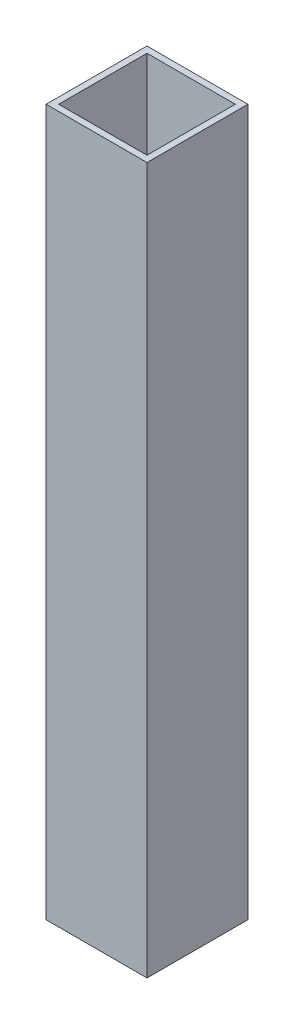
ISO-10303-21;
HEADER;
FILE_DESCRIPTION(('STEP AP214'),'2;1');
FILE_NAME('part.step','',(''),(''),'','','');
FILE_SCHEMA(('AUTOMOTIVE_DESIGN { 1 0 10303 214 1 1 1 1 }'));
ENDSEC;
DATA;
#1=APPLICATION_CONTEXT('core data for automotive mechanical design processes');
#2=APPLICATION_PROTOCOL_DEFINITION('international standard','automotive_design',2000,#1);
#3=PRODUCT_CONTEXT('',#1,'mechanical');
#4=PRODUCT('Part','Part','',(#3));
#5=PRODUCT_RELATED_PRODUCT_CATEGORY('part','',(#4));
#6=PRODUCT_DEFINITION_FORMATION('','',#4);
#7=PRODUCT_DEFINITION_CONTEXT('part definition',#1,'design');
#8=PRODUCT_DEFINITION('design','',#6,#7);
#9=PRODUCT_DEFINITION_SHAPE('','',#8);
#10=(LENGTH_UNIT() NAMED_UNIT(*) SI_UNIT(.MILLI.,.METRE.));
#11=(NAMED_UNIT(*) PLANE_ANGLE_UNIT() SI_UNIT($,.RADIAN.));
#12=(NAMED_UNIT(*) SI_UNIT($,.STERADIAN.) SOLID_ANGLE_UNIT());
#13=UNCERTAINTY_MEASURE_WITH_UNIT(LENGTH_MEASURE(1.E-05),#10,'distance_accuracy_value','');
#14=(GEOMETRIC_REPRESENTATION_CONTEXT(3) GLOBAL_UNCERTAINTY_ASSIGNED_CONTEXT((#13)) GLOBAL_UNIT_ASSIGNED_CONTEXT((#10,
#11,#12)) REPRESENTATION_CONTEXT('',''));
#15=CARTESIAN_POINT('',(0.,0.,0.));
#16=DIRECTION('',(0.,0.,1.));
#17=DIRECTION('',(1.,0.,0.));
#18=AXIS2_PLACEMENT_3D('',#15,#16,#17);
#19=CARTESIAN_POINT('',(0.,177.8,0.));
#20=DIRECTION('',(0.,1.,0.));
#21=DIRECTION('',(0.,0.,1.));
#22=AXIS2_PLACEMENT_3D('',#19,#20,#21);
#23=PLANE('',#22);
#24=DIRECTION('',(0.,0.,1.));
#25=VECTOR('',#24,1.);
#26=CARTESIAN_POINT('',(-12.7,177.8,12.7));
#27=LINE('',#26,#25);
#28=CARTESIAN_POINT('',(-12.7,177.8,-12.7));
#29=VERTEX_POINT('',#28);
#30=CARTESIAN_POINT('',(-12.7,177.8,12.7));
#31=VERTEX_POINT('',#30);
#32=EDGE_CURVE('E136',#29,#31,#27,.T.);
#33=ORIENTED_EDGE('',*,*,#32,.T.);
#34=DIRECTION('',(1.,0.,0.));
#35=VECTOR('',#34,1.);
#36=CARTESIAN_POINT('',(12.7,177.8,12.7));
#37=LINE('',#36,#35);
#38=CARTESIAN_POINT('',(12.7,177.8,12.7));
#39=VERTEX_POINT('',#38);
#40=EDGE_CURVE('E139',#31,#39,#37,.T.);
#41=ORIENTED_EDGE('',*,*,#40,.T.);
#42=DIRECTION('',(0.,0.,-1.));
#43=VECTOR('',#42,1.);
#44=CARTESIAN_POINT('',(12.7,177.8,12.7));
#45=LINE('',#44,#43);
#46=CARTESIAN_POINT('',(12.7,177.8,-12.7));
#47=VERTEX_POINT('',#46);
#48=EDGE_CURVE('E142',#39,#47,#45,.T.);
#49=ORIENTED_EDGE('',*,*,#48,.T.);
#50=DIRECTION('',(-1.,0.,0.));
#51=VECTOR('',#50,1.);
#52=CARTESIAN_POINT('',(12.7,177.8,-12.7));
#53=LINE('',#52,#51);
#54=EDGE_CURVE('E144',#47,#29,#53,.T.);
#55=ORIENTED_EDGE('',*,*,#54,.T.);
#56=EDGE_LOOP('',(#33,#41,#49,#55));
#57=FACE_BOUND('',#56,.T.);
#58=DIRECTION('',(1.,0.,0.));
#59=VECTOR('',#58,1.);
#60=CARTESIAN_POINT('',(11.1125,177.8,11.1125));
#61=LINE('',#60,#59);
#62=CARTESIAN_POINT('',(-11.1125,177.8,11.1125));
#63=VERTEX_POINT('',#62);
#64=CARTESIAN_POINT('',(11.1125,177.8,11.1125));
#65=VERTEX_POINT('',#64);
#66=EDGE_CURVE('E108',#63,#65,#61,.T.);
#67=ORIENTED_EDGE('',*,*,#66,.F.);
#68=DIRECTION('',(0.,0.,1.));
#69=VECTOR('',#68,1.);
#70=CARTESIAN_POINT('',(-11.1125,177.8,11.1125));
#71=LINE('',#70,#69);
#72=CARTESIAN_POINT('',(-11.1125,177.8,-11.1125));
#73=VERTEX_POINT('',#72);
#74=EDGE_CURVE('E100',#73,#63,#71,.T.);
#75=ORIENTED_EDGE('',*,*,#74,.F.);
#76=DIRECTION('',(-1.,0.,0.));
#77=VECTOR('',#76,1.);
#78=CARTESIAN_POINT('',(11.1125,177.8,-11.1125));
#79=LINE('',#78,#77);
#80=CARTESIAN_POINT('',(11.1125,177.8,-11.1125));
#81=VERTEX_POINT('',#80);
#82=EDGE_CURVE('E122',#81,#73,#79,.T.);
#83=ORIENTED_EDGE('',*,*,#82,.F.);
#84=DIRECTION('',(0.,0.,-1.));
#85=VECTOR('',#84,1.);
#86=CARTESIAN_POINT('',(11.1125,177.8,11.1125));
#87=LINE('',#86,#85);
#88=EDGE_CURVE('E120',#65,#81,#87,.T.);
#89=ORIENTED_EDGE('',*,*,#88,.F.);
#90=EDGE_LOOP('',(#67,#75,#83,#89));
#91=FACE_BOUND('',#90,.T.);
#92=ADVANCED_FACE('F35',(#57,#91),#23,.T.);
#93=CARTESIAN_POINT('',(0.,0.,0.));
#94=DIRECTION('',(0.,1.,0.));
#95=DIRECTION('',(0.,0.,1.));
#96=AXIS2_PLACEMENT_3D('',#93,#94,#95);
#97=PLANE('',#96);
#98=DIRECTION('',(0.,0.,1.));
#99=VECTOR('',#98,1.);
#100=CARTESIAN_POINT('',(-12.7,0.,12.7));
#101=LINE('',#100,#99);
#102=CARTESIAN_POINT('',(-12.7,0.,-12.7));
#103=VERTEX_POINT('',#102);
#104=CARTESIAN_POINT('',(-12.7,0.,12.7));
#105=VERTEX_POINT('',#104);
#106=EDGE_CURVE('E116',#103,#105,#101,.T.);
#107=ORIENTED_EDGE('',*,*,#106,.F.);
#108=DIRECTION('',(-1.,0.,0.));
#109=VECTOR('',#108,1.);
#110=CARTESIAN_POINT('',(12.7,0.,-12.7));
#111=LINE('',#110,#109);
#112=CARTESIAN_POINT('',(12.7,0.,-12.7));
#113=VERTEX_POINT('',#112);
#114=EDGE_CURVE('E140',#113,#103,#111,.T.);
#115=ORIENTED_EDGE('',*,*,#114,.F.);
#116=DIRECTION('',(0.,0.,-1.));
#117=VECTOR('',#116,1.);
#118=CARTESIAN_POINT('',(12.7,0.,12.7));
#119=LINE('',#118,#117);
#120=CARTESIAN_POINT('',(12.7,0.,12.7));
#121=VERTEX_POINT('',#120);
#122=EDGE_CURVE('E151',#121,#113,#119,.T.);
#123=ORIENTED_EDGE('',*,*,#122,.F.);
#124=DIRECTION('',(1.,0.,0.));
#125=VECTOR('',#124,1.);
#126=CARTESIAN_POINT('',(12.7,0.,12.7));
#127=LINE('',#126,#125);
#128=EDGE_CURVE('E149',#105,#121,#127,.T.);
#129=ORIENTED_EDGE('',*,*,#128,.F.);
#130=EDGE_LOOP('',(#107,#115,#123,#129));
#131=FACE_BOUND('',#130,.T.);
#132=DIRECTION('',(0.,0.,1.));
#133=VECTOR('',#132,1.);
#134=CARTESIAN_POINT('',(-11.1125,0.,11.1125));
#135=LINE('',#134,#133);
#136=CARTESIAN_POINT('',(-11.1125,0.,-11.1125));
#137=VERTEX_POINT('',#136);
#138=CARTESIAN_POINT('',(-11.1125,0.,11.1125));
#139=VERTEX_POINT('',#138);
#140=EDGE_CURVE('E58',#137,#139,#135,.T.);
#141=ORIENTED_EDGE('',*,*,#140,.T.);
#142=DIRECTION('',(1.,0.,0.));
#143=VECTOR('',#142,1.);
#144=CARTESIAN_POINT('',(11.1125,0.,11.1125));
#145=LINE('',#144,#143);
#146=CARTESIAN_POINT('',(11.1125,0.,11.1125));
#147=VERTEX_POINT('',#146);
#148=EDGE_CURVE('E115',#139,#147,#145,.T.);
#149=ORIENTED_EDGE('',*,*,#148,.T.);
#150=DIRECTION('',(0.,0.,-1.));
#151=VECTOR('',#150,1.);
#152=CARTESIAN_POINT('',(11.1125,0.,11.1125));
#153=LINE('',#152,#151);
#154=CARTESIAN_POINT('',(11.1125,0.,-11.1125));
#155=VERTEX_POINT('',#154);
#156=EDGE_CURVE('E128',#147,#155,#153,.T.);
#157=ORIENTED_EDGE('',*,*,#156,.T.);
#158=DIRECTION('',(-1.,0.,0.));
#159=VECTOR('',#158,1.);
#160=CARTESIAN_POINT('',(11.1125,0.,-11.1125));
#161=LINE('',#160,#159);
#162=EDGE_CURVE('E109',#155,#137,#161,.T.);
#163=ORIENTED_EDGE('',*,*,#162,.T.);
#164=EDGE_LOOP('',(#141,#149,#157,#163));
#165=FACE_BOUND('',#164,.T.);
#166=ADVANCED_FACE('F169',(#131,#165),#97,.F.);
#167=CARTESIAN_POINT('',(-12.7,177.8,12.7));
#168=DIRECTION('',(1.,0.,0.));
#169=DIRECTION('',(0.,0.,-1.));
#170=AXIS2_PLACEMENT_3D('',#167,#168,#169);
#171=PLANE('',#170);
#172=ORIENTED_EDGE('',*,*,#106,.T.);
#173=DIRECTION('',(0.,-1.,0.));
#174=VECTOR('',#173,1.);
#175=CARTESIAN_POINT('',(-12.7,177.8,12.7));
#176=LINE('',#175,#174);
#177=EDGE_CURVE('E11',#31,#105,#176,.T.);
#178=ORIENTED_EDGE('',*,*,#177,.F.);
#179=ORIENTED_EDGE('',*,*,#32,.F.);
#180=DIRECTION('',(0.,-1.,0.));
#181=VECTOR('',#180,1.);
#182=CARTESIAN_POINT('',(-12.7,177.8,-12.7));
#183=LINE('',#182,#181);
#184=EDGE_CURVE('E146',#29,#103,#183,.T.);
#185=ORIENTED_EDGE('',*,*,#184,.T.);
#186=EDGE_LOOP('',(#172,#178,#179,#185));
#187=FACE_BOUND('',#186,.T.);
#188=ADVANCED_FACE('F37',(#187),#171,.F.);
#189=CARTESIAN_POINT('',(12.7,177.8,12.7));
#190=DIRECTION('',(0.,0.,-1.));
#191=DIRECTION('',(-1.,0.,0.));
#192=AXIS2_PLACEMENT_3D('',#189,#190,#191);
#193=PLANE('',#192);
#194=ORIENTED_EDGE('',*,*,#128,.T.);
#195=DIRECTION('',(0.,-1.,0.));
#196=VECTOR('',#195,1.);
#197=CARTESIAN_POINT('',(12.7,177.8,12.7));
#198=LINE('',#197,#196);
#199=EDGE_CURVE('E43',#39,#121,#198,.T.);
#200=ORIENTED_EDGE('',*,*,#199,.F.);
#201=ORIENTED_EDGE('',*,*,#40,.F.);
#202=ORIENTED_EDGE('',*,*,#177,.T.);
#203=EDGE_LOOP('',(#194,#200,#201,#202));
#204=FACE_BOUND('',#203,.T.);
#205=ADVANCED_FACE('F179',(#204),#193,.F.);
#206=CARTESIAN_POINT('',(12.7,177.8,12.7));
#207=DIRECTION('',(-1.,0.,0.));
#208=DIRECTION('',(0.,0.,1.));
#209=AXIS2_PLACEMENT_3D('',#206,#207,#208);
#210=PLANE('',#209);
#211=ORIENTED_EDGE('',*,*,#122,.T.);
#212=DIRECTION('',(0.,-1.,0.));
#213=VECTOR('',#212,1.);
#214=CARTESIAN_POINT('',(12.7,177.8,-12.7));
#215=LINE('',#214,#213);
#216=EDGE_CURVE('E156',#47,#113,#215,.T.);
#217=ORIENTED_EDGE('',*,*,#216,.F.);
#218=ORIENTED_EDGE('',*,*,#48,.F.);
#219=ORIENTED_EDGE('',*,*,#199,.T.);
#220=EDGE_LOOP('',(#211,#217,#218,#219));
#221=FACE_BOUND('',#220,.T.);
#222=ADVANCED_FACE('F163',(#221),#210,.F.);
#223=CARTESIAN_POINT('',(12.7,177.8,-12.7));
#224=DIRECTION('',(0.,0.,1.));
#225=DIRECTION('',(1.,0.,0.));
#226=AXIS2_PLACEMENT_3D('',#223,#224,#225);
#227=PLANE('',#226);
#228=ORIENTED_EDGE('',*,*,#114,.T.);
#229=ORIENTED_EDGE('',*,*,#184,.F.);
#230=ORIENTED_EDGE('',*,*,#54,.F.);
#231=ORIENTED_EDGE('',*,*,#216,.T.);
#232=EDGE_LOOP('',(#228,#229,#230,#231));
#233=FACE_BOUND('',#232,.T.);
#234=ADVANCED_FACE('F173',(#233),#227,.F.);
#235=CARTESIAN_POINT('',(-11.1125,177.8,11.1125));
#236=DIRECTION('',(1.,0.,0.));
#237=DIRECTION('',(0.,0.,-1.));
#238=AXIS2_PLACEMENT_3D('',#235,#236,#237);
#239=PLANE('',#238);
#240=ORIENTED_EDGE('',*,*,#140,.F.);
#241=DIRECTION('',(0.,-1.,0.));
#242=VECTOR('',#241,1.);
#243=CARTESIAN_POINT('',(-11.1125,177.8,-11.1125));
#244=LINE('',#243,#242);
#245=EDGE_CURVE('E104',#73,#137,#244,.T.);
#246=ORIENTED_EDGE('',*,*,#245,.F.);
#247=ORIENTED_EDGE('',*,*,#74,.T.);
#248=DIRECTION('',(0.,-1.,0.));
#249=VECTOR('',#248,1.);
#250=CARTESIAN_POINT('',(-11.1125,177.8,11.1125));
#251=LINE('',#250,#249);
#252=EDGE_CURVE('E103',#63,#139,#251,.T.);
#253=ORIENTED_EDGE('',*,*,#252,.T.);
#254=EDGE_LOOP('',(#240,#246,#247,#253));
#255=FACE_BOUND('',#254,.T.);
#256=ADVANCED_FACE('F102',(#255),#239,.T.);
#257=CARTESIAN_POINT('',(11.1125,177.8,11.1125));
#258=DIRECTION('',(0.,0.,-1.));
#259=DIRECTION('',(-1.,0.,0.));
#260=AXIS2_PLACEMENT_3D('',#257,#258,#259);
#261=PLANE('',#260);
#262=ORIENTED_EDGE('',*,*,#148,.F.);
#263=ORIENTED_EDGE('',*,*,#252,.F.);
#264=ORIENTED_EDGE('',*,*,#66,.T.);
#265=DIRECTION('',(0.,-1.,0.));
#266=VECTOR('',#265,1.);
#267=CARTESIAN_POINT('',(11.1125,177.8,11.1125));
#268=LINE('',#267,#266);
#269=EDGE_CURVE('E117',#65,#147,#268,.T.);
#270=ORIENTED_EDGE('',*,*,#269,.T.);
#271=EDGE_LOOP('',(#262,#263,#264,#270));
#272=FACE_BOUND('',#271,.T.);
#273=ADVANCED_FACE('F112',(#272),#261,.T.);
#274=CARTESIAN_POINT('',(11.1125,177.8,11.1125));
#275=DIRECTION('',(-1.,0.,0.));
#276=DIRECTION('',(0.,0.,1.));
#277=AXIS2_PLACEMENT_3D('',#274,#275,#276);
#278=PLANE('',#277);
#279=ORIENTED_EDGE('',*,*,#156,.F.);
#280=ORIENTED_EDGE('',*,*,#269,.F.);
#281=ORIENTED_EDGE('',*,*,#88,.T.);
#282=DIRECTION('',(0.,-1.,0.));
#283=VECTOR('',#282,1.);
#284=CARTESIAN_POINT('',(11.1125,177.8,-11.1125));
#285=LINE('',#284,#283);
#286=EDGE_CURVE('E50',#81,#155,#285,.T.);
#287=ORIENTED_EDGE('',*,*,#286,.T.);
#288=EDGE_LOOP('',(#279,#280,#281,#287));
#289=FACE_BOUND('',#288,.T.);
#290=ADVANCED_FACE('F202',(#289),#278,.T.);
#291=CARTESIAN_POINT('',(11.1125,177.8,-11.1125));
#292=DIRECTION('',(0.,0.,1.));
#293=DIRECTION('',(1.,0.,0.));
#294=AXIS2_PLACEMENT_3D('',#291,#292,#293);
#295=PLANE('',#294);
#296=ORIENTED_EDGE('',*,*,#162,.F.);
#297=ORIENTED_EDGE('',*,*,#286,.F.);
#298=ORIENTED_EDGE('',*,*,#82,.T.);
#299=ORIENTED_EDGE('',*,*,#245,.T.);
#300=EDGE_LOOP('',(#296,#297,#298,#299));
#301=FACE_BOUND('',#300,.T.);
#302=ADVANCED_FACE('F206',(#301),#295,.T.);
#303=CLOSED_SHELL('',(#92,#166,#188,#205,#222,#234,#256,#273,#290,#302));
#304=MANIFOLD_SOLID_BREP('B2',#303);
#305=ADVANCED_BREP_SHAPE_REPRESENTATION('',(#18,#304),#14);
#306=SHAPE_DEFINITION_REPRESENTATION(#9,#305);
ENDSEC;
END-ISO-10303-21;
